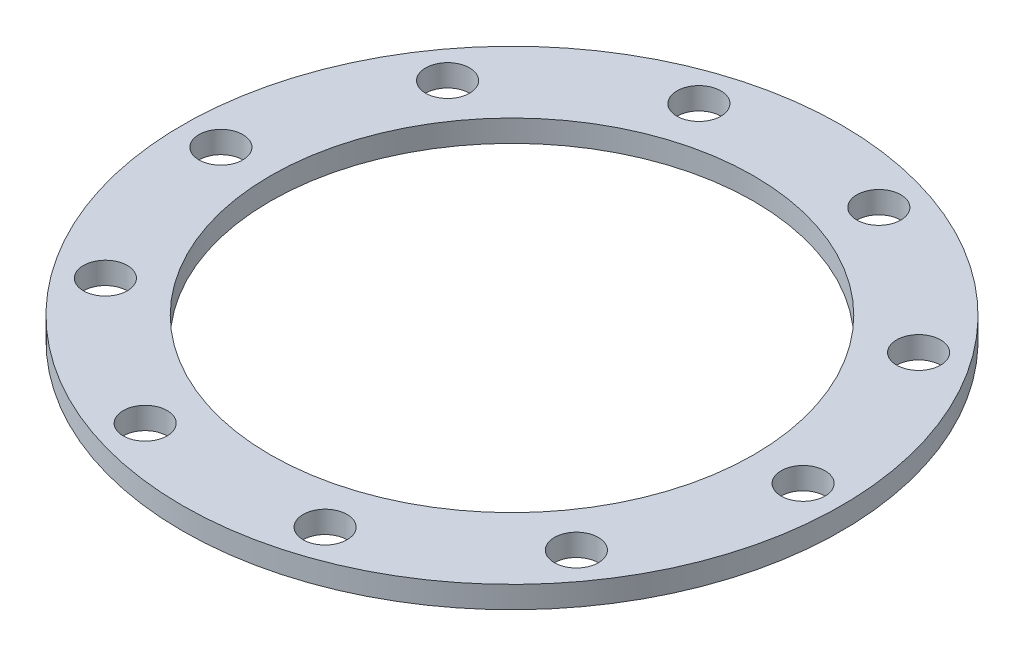
ISO-10303-21;
HEADER;
FILE_DESCRIPTION(('STEP AP214'),'2;1');
FILE_NAME('part.step','',(''),(''),'','','');
FILE_SCHEMA(('AUTOMOTIVE_DESIGN { 1 0 10303 214 1 1 1 1 }'));
ENDSEC;
DATA;
#1=APPLICATION_CONTEXT('core data for automotive mechanical design processes');
#2=APPLICATION_PROTOCOL_DEFINITION('international standard','automotive_design',2000,#1);
#3=PRODUCT_CONTEXT('',#1,'mechanical');
#4=PRODUCT('Part','Part','',(#3));
#5=PRODUCT_RELATED_PRODUCT_CATEGORY('part','',(#4));
#6=PRODUCT_DEFINITION_FORMATION('','',#4);
#7=PRODUCT_DEFINITION_CONTEXT('part definition',#1,'design');
#8=PRODUCT_DEFINITION('design','',#6,#7);
#9=PRODUCT_DEFINITION_SHAPE('','',#8);
#10=(LENGTH_UNIT() NAMED_UNIT(*) SI_UNIT(.MILLI.,.METRE.));
#11=(NAMED_UNIT(*) PLANE_ANGLE_UNIT() SI_UNIT($,.RADIAN.));
#12=(NAMED_UNIT(*) SI_UNIT($,.STERADIAN.) SOLID_ANGLE_UNIT());
#13=UNCERTAINTY_MEASURE_WITH_UNIT(LENGTH_MEASURE(1.E-05),#10,'distance_accuracy_value','');
#14=(GEOMETRIC_REPRESENTATION_CONTEXT(3) GLOBAL_UNCERTAINTY_ASSIGNED_CONTEXT((#13)) GLOBAL_UNIT_ASSIGNED_CONTEXT((#10,
#11,#12)) REPRESENTATION_CONTEXT('',''));
#15=CARTESIAN_POINT('',(0.,0.,0.));
#16=DIRECTION('',(0.,0.,1.));
#17=DIRECTION('',(1.,0.,0.));
#18=AXIS2_PLACEMENT_3D('',#15,#16,#17);
#19=CARTESIAN_POINT('',(0.,5.08,0.));
#20=DIRECTION('',(0.,1.,0.));
#21=DIRECTION('',(0.,0.,1.));
#22=AXIS2_PLACEMENT_3D('',#19,#20,#21);
#23=PLANE('',#22);
#24=CARTESIAN_POINT('',(-54.4549338913782,5.08,-39.5638253318056));
#25=DIRECTION('',(0.,1.,0.));
#26=DIRECTION('',(-0.587785252292462,0.,0.809016994374955));
#27=AXIS2_PLACEMENT_3D('',#24,#25,#26);
#28=CIRCLE('',#27,5.08);
#29=CARTESIAN_POINT('',(-57.4408829730239,5.08,-35.4540190003809));
#30=VERTEX_POINT('',#29);
#31=EDGE_CURVE('E62',#30,#30,#28,.T.);
#32=ORIENTED_EDGE('',*,*,#31,.F.);
#33=EDGE_LOOP('',(#32));
#34=FACE_BOUND('',#33,.T.);
#35=CARTESIAN_POINT('',(-20.7999338913784,5.08,-64.0156141118266));
#36=DIRECTION('',(0.,1.,0.));
#37=DIRECTION('',(-0.95105651629515,0.,0.309016994374958));
#38=AXIS2_PLACEMENT_3D('',#35,#36,#37);
#39=CIRCLE('',#38,5.08);
#40=CARTESIAN_POINT('',(-25.6313009941578,5.08,-62.4458077804018));
#41=VERTEX_POINT('',#40);
#42=EDGE_CURVE('E68',#41,#41,#39,.T.);
#43=ORIENTED_EDGE('',*,*,#42,.F.);
#44=EDGE_LOOP('',(#43));
#45=FACE_BOUND('',#44,.T.);
#46=CARTESIAN_POINT('',(20.7999338913771,5.08,-64.015614111827));
#47=DIRECTION('',(0.,1.,0.));
#48=DIRECTION('',(-0.951056516295157,0.,-0.309016994374938));
#49=AXIS2_PLACEMENT_3D('',#46,#47,#48);
#50=CIRCLE('',#49,5.08);
#51=CARTESIAN_POINT('',(15.9685667885977,5.08,-65.5854204432517));
#52=VERTEX_POINT('',#51);
#53=EDGE_CURVE('E74',#52,#52,#50,.T.);
#54=ORIENTED_EDGE('',*,*,#53,.F.);
#55=EDGE_LOOP('',(#54));
#56=FACE_BOUND('',#55,.T.);
#57=CARTESIAN_POINT('',(54.4549338913774,5.08,-39.5638253318068));
#58=DIRECTION('',(0.,1.,0.));
#59=DIRECTION('',(-0.58778525229248,0.,-0.809016994374942));
#60=AXIS2_PLACEMENT_3D('',#57,#58,#59);
#61=CIRCLE('',#60,5.08);
#62=CARTESIAN_POINT('',(51.4689848097315,5.08,-43.6736316632316));
#63=VERTEX_POINT('',#62);
#64=EDGE_CURVE('E80',#63,#63,#61,.T.);
#65=ORIENTED_EDGE('',*,*,#64,.F.);
#66=EDGE_LOOP('',(#65));
#67=FACE_BOUND('',#66,.T.);
#68=CARTESIAN_POINT('',(67.31,5.08,0.));
#69=DIRECTION('',(0.,1.,0.));
#70=DIRECTION('',(0.,0.,-1.));
#71=AXIS2_PLACEMENT_3D('',#68,#69,#70);
#72=CIRCLE('',#71,5.08);
#73=CARTESIAN_POINT('',(67.31,5.08,-5.08000000000001));
#74=VERTEX_POINT('',#73);
#75=EDGE_CURVE('E86',#74,#74,#72,.T.);
#76=ORIENTED_EDGE('',*,*,#75,.F.);
#77=EDGE_LOOP('',(#76));
#78=FACE_BOUND('',#77,.T.);
#79=CARTESIAN_POINT('',(54.4549338913779,5.08,39.5638253318061));
#80=DIRECTION('',(0.,1.,0.));
#81=DIRECTION('',(0.587785252292469,0.,-0.809016994374951));
#82=AXIS2_PLACEMENT_3D('',#79,#80,#81);
#83=CIRCLE('',#82,5.08);
#84=CARTESIAN_POINT('',(57.4408829730237,5.08,35.4540190003813));
#85=VERTEX_POINT('',#84);
#86=EDGE_CURVE('E92',#85,#85,#83,.T.);
#87=ORIENTED_EDGE('',*,*,#86,.F.);
#88=EDGE_LOOP('',(#87));
#89=FACE_BOUND('',#88,.T.);
#90=CARTESIAN_POINT('',(20.799933891378,5.08,64.0156141118267));
#91=DIRECTION('',(0.,1.,0.));
#92=DIRECTION('',(0.951056516295152,0.,-0.309016994374952));
#93=AXIS2_PLACEMENT_3D('',#90,#91,#92);
#94=CIRCLE('',#93,5.08);
#95=CARTESIAN_POINT('',(25.6313009941574,5.08,62.4458077804019));
#96=VERTEX_POINT('',#95);
#97=EDGE_CURVE('E98',#96,#96,#94,.T.);
#98=ORIENTED_EDGE('',*,*,#97,.F.);
#99=EDGE_LOOP('',(#98));
#100=FACE_BOUND('',#99,.T.);
#101=CARTESIAN_POINT('',(-20.7999338913775,5.08,64.0156141118268));
#102=DIRECTION('',(0.,1.,0.));
#103=DIRECTION('',(0.951056516295155,0.,0.309016994374945));
#104=AXIS2_PLACEMENT_3D('',#101,#102,#103);
#105=CIRCLE('',#104,5.08);
#106=CARTESIAN_POINT('',(-15.9685667885981,5.08,65.5854204432516));
#107=VERTEX_POINT('',#106);
#108=EDGE_CURVE('E104',#107,#107,#105,.T.);
#109=ORIENTED_EDGE('',*,*,#108,.F.);
#110=EDGE_LOOP('',(#109));
#111=FACE_BOUND('',#110,.T.);
#112=CARTESIAN_POINT('',(-54.4549338913777,5.08,39.5638253318065));
#113=DIRECTION('',(0.,1.,0.));
#114=DIRECTION('',(0.587785252292474,0.,0.809016994374947));
#115=AXIS2_PLACEMENT_3D('',#112,#113,#114);
#116=CIRCLE('',#115,5.08);
#117=CARTESIAN_POINT('',(-51.4689848097319,5.08,43.6736316632312));
#118=VERTEX_POINT('',#117);
#119=EDGE_CURVE('E56',#118,#118,#116,.T.);
#120=ORIENTED_EDGE('',*,*,#119,.F.);
#121=EDGE_LOOP('',(#120));
#122=FACE_BOUND('',#121,.T.);
#123=CARTESIAN_POINT('',(-67.31,5.08,0.));
#124=DIRECTION('',(0.,1.,0.));
#125=DIRECTION('',(0.,0.,1.));
#126=AXIS2_PLACEMENT_3D('',#123,#124,#125);
#127=CIRCLE('',#126,5.08);
#128=CARTESIAN_POINT('',(-67.31,5.08,5.08000000000001));
#129=VERTEX_POINT('',#128);
#130=EDGE_CURVE('E50',#129,#129,#127,.T.);
#131=ORIENTED_EDGE('',*,*,#130,.F.);
#132=EDGE_LOOP('',(#131));
#133=FACE_BOUND('',#132,.T.);
#134=CARTESIAN_POINT('',(0.,5.08,0.));
#135=DIRECTION('',(0.,1.,0.));
#136=DIRECTION('',(0.,0.,1.));
#137=AXIS2_PLACEMENT_3D('',#134,#135,#136);
#138=CIRCLE('',#137,76.2);
#139=CARTESIAN_POINT('',(0.,5.08,76.2));
#140=VERTEX_POINT('',#139);
#141=EDGE_CURVE('E10',#140,#140,#138,.T.);
#142=ORIENTED_EDGE('',*,*,#141,.T.);
#143=EDGE_LOOP('',(#142));
#144=FACE_BOUND('',#143,.T.);
#145=CARTESIAN_POINT('',(0.,5.08,0.));
#146=DIRECTION('',(0.,1.,0.));
#147=DIRECTION('',(0.,0.,1.));
#148=AXIS2_PLACEMENT_3D('',#145,#146,#147);
#149=CIRCLE('',#148,55.88);
#150=CARTESIAN_POINT('',(0.,5.08,55.88));
#151=VERTEX_POINT('',#150);
#152=EDGE_CURVE('E42',#151,#151,#149,.T.);
#153=ORIENTED_EDGE('',*,*,#152,.F.);
#154=EDGE_LOOP('',(#153));
#155=FACE_BOUND('',#154,.T.);
#156=ADVANCED_FACE('F31',(#34,#45,#56,#67,#78,#89,#100,#111,#122,#133,#144,#155),#23,.T.);
#157=CARTESIAN_POINT('',(0.,0.,0.));
#158=DIRECTION('',(0.,1.,0.));
#159=DIRECTION('',(0.,0.,1.));
#160=AXIS2_PLACEMENT_3D('',#157,#158,#159);
#161=PLANE('',#160);
#162=CARTESIAN_POINT('',(-54.4549338913782,0.,-39.5638253318056));
#163=DIRECTION('',(0.,1.,0.));
#164=DIRECTION('',(-0.587785252292462,0.,0.809016994374955));
#165=AXIS2_PLACEMENT_3D('',#162,#163,#164);
#166=CIRCLE('',#165,5.08);
#167=CARTESIAN_POINT('',(-57.4408829730239,0.,-35.4540190003809));
#168=VERTEX_POINT('',#167);
#169=EDGE_CURVE('E65',#168,#168,#166,.T.);
#170=ORIENTED_EDGE('',*,*,#169,.T.);
#171=EDGE_LOOP('',(#170));
#172=FACE_BOUND('',#171,.T.);
#173=CARTESIAN_POINT('',(-20.7999338913784,0.,-64.0156141118266));
#174=DIRECTION('',(0.,1.,0.));
#175=DIRECTION('',(-0.95105651629515,0.,0.309016994374958));
#176=AXIS2_PLACEMENT_3D('',#173,#174,#175);
#177=CIRCLE('',#176,5.08);
#178=CARTESIAN_POINT('',(-25.6313009941578,0.,-62.4458077804018));
#179=VERTEX_POINT('',#178);
#180=EDGE_CURVE('E71',#179,#179,#177,.T.);
#181=ORIENTED_EDGE('',*,*,#180,.T.);
#182=EDGE_LOOP('',(#181));
#183=FACE_BOUND('',#182,.T.);
#184=CARTESIAN_POINT('',(20.7999338913771,0.,-64.015614111827));
#185=DIRECTION('',(0.,1.,0.));
#186=DIRECTION('',(-0.951056516295157,0.,-0.309016994374938));
#187=AXIS2_PLACEMENT_3D('',#184,#185,#186);
#188=CIRCLE('',#187,5.08);
#189=CARTESIAN_POINT('',(15.9685667885977,0.,-65.5854204432517));
#190=VERTEX_POINT('',#189);
#191=EDGE_CURVE('E77',#190,#190,#188,.T.);
#192=ORIENTED_EDGE('',*,*,#191,.T.);
#193=EDGE_LOOP('',(#192));
#194=FACE_BOUND('',#193,.T.);
#195=CARTESIAN_POINT('',(54.4549338913774,0.,-39.5638253318068));
#196=DIRECTION('',(0.,1.,0.));
#197=DIRECTION('',(-0.58778525229248,0.,-0.809016994374942));
#198=AXIS2_PLACEMENT_3D('',#195,#196,#197);
#199=CIRCLE('',#198,5.08);
#200=CARTESIAN_POINT('',(51.4689848097315,0.,-43.6736316632316));
#201=VERTEX_POINT('',#200);
#202=EDGE_CURVE('E83',#201,#201,#199,.T.);
#203=ORIENTED_EDGE('',*,*,#202,.T.);
#204=EDGE_LOOP('',(#203));
#205=FACE_BOUND('',#204,.T.);
#206=CARTESIAN_POINT('',(67.31,0.,0.));
#207=DIRECTION('',(0.,1.,0.));
#208=DIRECTION('',(0.,0.,-1.));
#209=AXIS2_PLACEMENT_3D('',#206,#207,#208);
#210=CIRCLE('',#209,5.08);
#211=CARTESIAN_POINT('',(67.31,0.,-5.08000000000001));
#212=VERTEX_POINT('',#211);
#213=EDGE_CURVE('E89',#212,#212,#210,.T.);
#214=ORIENTED_EDGE('',*,*,#213,.T.);
#215=EDGE_LOOP('',(#214));
#216=FACE_BOUND('',#215,.T.);
#217=CARTESIAN_POINT('',(54.4549338913779,0.,39.5638253318061));
#218=DIRECTION('',(0.,1.,0.));
#219=DIRECTION('',(0.587785252292469,0.,-0.809016994374951));
#220=AXIS2_PLACEMENT_3D('',#217,#218,#219);
#221=CIRCLE('',#220,5.08);
#222=CARTESIAN_POINT('',(57.4408829730237,0.,35.4540190003813));
#223=VERTEX_POINT('',#222);
#224=EDGE_CURVE('E95',#223,#223,#221,.T.);
#225=ORIENTED_EDGE('',*,*,#224,.T.);
#226=EDGE_LOOP('',(#225));
#227=FACE_BOUND('',#226,.T.);
#228=CARTESIAN_POINT('',(20.799933891378,0.,64.0156141118267));
#229=DIRECTION('',(0.,1.,0.));
#230=DIRECTION('',(0.951056516295152,0.,-0.309016994374952));
#231=AXIS2_PLACEMENT_3D('',#228,#229,#230);
#232=CIRCLE('',#231,5.08);
#233=CARTESIAN_POINT('',(25.6313009941574,0.,62.4458077804019));
#234=VERTEX_POINT('',#233);
#235=EDGE_CURVE('E101',#234,#234,#232,.T.);
#236=ORIENTED_EDGE('',*,*,#235,.T.);
#237=EDGE_LOOP('',(#236));
#238=FACE_BOUND('',#237,.T.);
#239=CARTESIAN_POINT('',(-20.7999338913775,0.,64.0156141118268));
#240=DIRECTION('',(0.,1.,0.));
#241=DIRECTION('',(0.951056516295155,0.,0.309016994374945));
#242=AXIS2_PLACEMENT_3D('',#239,#240,#241);
#243=CIRCLE('',#242,5.08);
#244=CARTESIAN_POINT('',(-15.9685667885981,0.,65.5854204432516));
#245=VERTEX_POINT('',#244);
#246=EDGE_CURVE('E59',#245,#245,#243,.T.);
#247=ORIENTED_EDGE('',*,*,#246,.T.);
#248=EDGE_LOOP('',(#247));
#249=FACE_BOUND('',#248,.T.);
#250=CARTESIAN_POINT('',(-54.4549338913777,0.,39.5638253318065));
#251=DIRECTION('',(0.,1.,0.));
#252=DIRECTION('',(0.587785252292474,0.,0.809016994374947));
#253=AXIS2_PLACEMENT_3D('',#250,#251,#252);
#254=CIRCLE('',#253,5.08);
#255=CARTESIAN_POINT('',(-51.4689848097319,0.,43.6736316632312));
#256=VERTEX_POINT('',#255);
#257=EDGE_CURVE('E53',#256,#256,#254,.T.);
#258=ORIENTED_EDGE('',*,*,#257,.T.);
#259=EDGE_LOOP('',(#258));
#260=FACE_BOUND('',#259,.T.);
#261=CARTESIAN_POINT('',(-67.31,0.,0.));
#262=DIRECTION('',(0.,1.,0.));
#263=DIRECTION('',(0.,0.,1.));
#264=AXIS2_PLACEMENT_3D('',#261,#262,#263);
#265=CIRCLE('',#264,5.08);
#266=CARTESIAN_POINT('',(-67.31,0.,5.08000000000001));
#267=VERTEX_POINT('',#266);
#268=EDGE_CURVE('E47',#267,#267,#265,.T.);
#269=ORIENTED_EDGE('',*,*,#268,.T.);
#270=EDGE_LOOP('',(#269));
#271=FACE_BOUND('',#270,.T.);
#272=CARTESIAN_POINT('',(0.,0.,0.));
#273=DIRECTION('',(0.,1.,0.));
#274=DIRECTION('',(0.,0.,1.));
#275=AXIS2_PLACEMENT_3D('',#272,#273,#274);
#276=CIRCLE('',#275,76.2);
#277=CARTESIAN_POINT('',(0.,0.,76.2));
#278=VERTEX_POINT('',#277);
#279=EDGE_CURVE('E35',#278,#278,#276,.T.);
#280=ORIENTED_EDGE('',*,*,#279,.F.);
#281=EDGE_LOOP('',(#280));
#282=FACE_BOUND('',#281,.T.);
#283=CARTESIAN_POINT('',(0.,0.,0.));
#284=DIRECTION('',(0.,1.,0.));
#285=DIRECTION('',(0.,0.,1.));
#286=AXIS2_PLACEMENT_3D('',#283,#284,#285);
#287=CIRCLE('',#286,55.88);
#288=CARTESIAN_POINT('',(0.,0.,55.88));
#289=VERTEX_POINT('',#288);
#290=EDGE_CURVE('E44',#289,#289,#287,.T.);
#291=ORIENTED_EDGE('',*,*,#290,.T.);
#292=EDGE_LOOP('',(#291));
#293=FACE_BOUND('',#292,.T.);
#294=ADVANCED_FACE('F110',(#172,#183,#194,#205,#216,#227,#238,#249,#260,#271,#282,#293),#161,.F.);
#295=CARTESIAN_POINT('',(0.,5.08,0.));
#296=DIRECTION('',(0.,-1.,0.));
#297=DIRECTION('',(0.,0.,-1.));
#298=AXIS2_PLACEMENT_3D('',#295,#296,#297);
#299=CYLINDRICAL_SURFACE('',#298,76.2);
#300=ORIENTED_EDGE('',*,*,#141,.F.);
#301=EDGE_LOOP('',(#300));
#302=FACE_BOUND('',#301,.T.);
#303=ORIENTED_EDGE('',*,*,#279,.T.);
#304=EDGE_LOOP('',(#303));
#305=FACE_BOUND('',#304,.T.);
#306=ADVANCED_FACE('F33',(#302,#305),#299,.T.);
#307=CARTESIAN_POINT('',(0.,5.08,0.));
#308=DIRECTION('',(0.,-1.,0.));
#309=DIRECTION('',(0.,0.,-1.));
#310=AXIS2_PLACEMENT_3D('',#307,#308,#309);
#311=CYLINDRICAL_SURFACE('',#310,55.88);
#312=ORIENTED_EDGE('',*,*,#152,.T.);
#313=EDGE_LOOP('',(#312));
#314=FACE_BOUND('',#313,.T.);
#315=ORIENTED_EDGE('',*,*,#290,.F.);
#316=EDGE_LOOP('',(#315));
#317=FACE_BOUND('',#316,.T.);
#318=ADVANCED_FACE('F131',(#314,#317),#311,.F.);
#319=CARTESIAN_POINT('',(-67.31,0.,0.));
#320=DIRECTION('',(0.,1.,0.));
#321=DIRECTION('',(0.,0.,1.));
#322=AXIS2_PLACEMENT_3D('',#319,#320,#321);
#323=CYLINDRICAL_SURFACE('',#322,5.08);
#324=ORIENTED_EDGE('',*,*,#268,.F.);
#325=EDGE_LOOP('',(#324));
#326=FACE_BOUND('',#325,.T.);
#327=ORIENTED_EDGE('',*,*,#130,.T.);
#328=EDGE_LOOP('',(#327));
#329=FACE_BOUND('',#328,.T.);
#330=ADVANCED_FACE('F134',(#326,#329),#323,.F.);
#331=CARTESIAN_POINT('',(-54.4549338913777,0.,39.5638253318065));
#332=DIRECTION('',(0.,1.,0.));
#333=DIRECTION('',(0.,0.,1.));
#334=AXIS2_PLACEMENT_3D('',#331,#332,#333);
#335=CYLINDRICAL_SURFACE('',#334,5.08);
#336=ORIENTED_EDGE('',*,*,#257,.F.);
#337=EDGE_LOOP('',(#336));
#338=FACE_BOUND('',#337,.T.);
#339=ORIENTED_EDGE('',*,*,#119,.T.);
#340=EDGE_LOOP('',(#339));
#341=FACE_BOUND('',#340,.T.);
#342=ADVANCED_FACE('F117',(#338,#341),#335,.F.);
#343=CARTESIAN_POINT('',(-20.7999338913775,0.,64.0156141118268));
#344=DIRECTION('',(0.,1.,0.));
#345=DIRECTION('',(0.,0.,1.));
#346=AXIS2_PLACEMENT_3D('',#343,#344,#345);
#347=CYLINDRICAL_SURFACE('',#346,5.08);
#348=ORIENTED_EDGE('',*,*,#246,.F.);
#349=EDGE_LOOP('',(#348));
#350=FACE_BOUND('',#349,.T.);
#351=ORIENTED_EDGE('',*,*,#108,.T.);
#352=EDGE_LOOP('',(#351));
#353=FACE_BOUND('',#352,.T.);
#354=ADVANCED_FACE('F113',(#350,#353),#347,.F.);
#355=CARTESIAN_POINT('',(20.799933891378,0.,64.0156141118267));
#356=DIRECTION('',(0.,1.,0.));
#357=DIRECTION('',(0.,0.,1.));
#358=AXIS2_PLACEMENT_3D('',#355,#356,#357);
#359=CYLINDRICAL_SURFACE('',#358,5.08);
#360=ORIENTED_EDGE('',*,*,#235,.F.);
#361=EDGE_LOOP('',(#360));
#362=FACE_BOUND('',#361,.T.);
#363=ORIENTED_EDGE('',*,*,#97,.T.);
#364=EDGE_LOOP('',(#363));
#365=FACE_BOUND('',#364,.T.);
#366=ADVANCED_FACE('F116',(#362,#365),#359,.F.);
#367=CARTESIAN_POINT('',(54.4549338913779,0.,39.5638253318061));
#368=DIRECTION('',(0.,1.,0.));
#369=DIRECTION('',(0.,0.,1.));
#370=AXIS2_PLACEMENT_3D('',#367,#368,#369);
#371=CYLINDRICAL_SURFACE('',#370,5.08);
#372=ORIENTED_EDGE('',*,*,#224,.F.);
#373=EDGE_LOOP('',(#372));
#374=FACE_BOUND('',#373,.T.);
#375=ORIENTED_EDGE('',*,*,#86,.T.);
#376=EDGE_LOOP('',(#375));
#377=FACE_BOUND('',#376,.T.);
#378=ADVANCED_FACE('F171',(#374,#377),#371,.F.);
#379=CARTESIAN_POINT('',(67.31,0.,0.));
#380=DIRECTION('',(0.,1.,0.));
#381=DIRECTION('',(0.,0.,1.));
#382=AXIS2_PLACEMENT_3D('',#379,#380,#381);
#383=CYLINDRICAL_SURFACE('',#382,5.08);
#384=ORIENTED_EDGE('',*,*,#213,.F.);
#385=EDGE_LOOP('',(#384));
#386=FACE_BOUND('',#385,.T.);
#387=ORIENTED_EDGE('',*,*,#75,.T.);
#388=EDGE_LOOP('',(#387));
#389=FACE_BOUND('',#388,.T.);
#390=ADVANCED_FACE('F167',(#386,#389),#383,.F.);
#391=CARTESIAN_POINT('',(54.4549338913774,0.,-39.5638253318068));
#392=DIRECTION('',(0.,1.,0.));
#393=DIRECTION('',(0.,0.,1.));
#394=AXIS2_PLACEMENT_3D('',#391,#392,#393);
#395=CYLINDRICAL_SURFACE('',#394,5.08);
#396=ORIENTED_EDGE('',*,*,#202,.F.);
#397=EDGE_LOOP('',(#396));
#398=FACE_BOUND('',#397,.T.);
#399=ORIENTED_EDGE('',*,*,#64,.T.);
#400=EDGE_LOOP('',(#399));
#401=FACE_BOUND('',#400,.T.);
#402=ADVANCED_FACE('F163',(#398,#401),#395,.F.);
#403=CARTESIAN_POINT('',(20.7999338913771,0.,-64.015614111827));
#404=DIRECTION('',(0.,1.,0.));
#405=DIRECTION('',(0.,0.,1.));
#406=AXIS2_PLACEMENT_3D('',#403,#404,#405);
#407=CYLINDRICAL_SURFACE('',#406,5.08);
#408=ORIENTED_EDGE('',*,*,#191,.F.);
#409=EDGE_LOOP('',(#408));
#410=FACE_BOUND('',#409,.T.);
#411=ORIENTED_EDGE('',*,*,#53,.T.);
#412=EDGE_LOOP('',(#411));
#413=FACE_BOUND('',#412,.T.);
#414=ADVANCED_FACE('F159',(#410,#413),#407,.F.);
#415=CARTESIAN_POINT('',(-20.7999338913784,0.,-64.0156141118266));
#416=DIRECTION('',(0.,1.,0.));
#417=DIRECTION('',(0.,0.,1.));
#418=AXIS2_PLACEMENT_3D('',#415,#416,#417);
#419=CYLINDRICAL_SURFACE('',#418,5.08);
#420=ORIENTED_EDGE('',*,*,#180,.F.);
#421=EDGE_LOOP('',(#420));
#422=FACE_BOUND('',#421,.T.);
#423=ORIENTED_EDGE('',*,*,#42,.T.);
#424=EDGE_LOOP('',(#423));
#425=FACE_BOUND('',#424,.T.);
#426=ADVANCED_FACE('F155',(#422,#425),#419,.F.);
#427=CARTESIAN_POINT('',(-54.4549338913782,0.,-39.5638253318056));
#428=DIRECTION('',(0.,1.,0.));
#429=DIRECTION('',(0.,0.,1.));
#430=AXIS2_PLACEMENT_3D('',#427,#428,#429);
#431=CYLINDRICAL_SURFACE('',#430,5.08);
#432=ORIENTED_EDGE('',*,*,#169,.F.);
#433=EDGE_LOOP('',(#432));
#434=FACE_BOUND('',#433,.T.);
#435=ORIENTED_EDGE('',*,*,#31,.T.);
#436=EDGE_LOOP('',(#435));
#437=FACE_BOUND('',#436,.T.);
#438=ADVANCED_FACE('F152',(#434,#437),#431,.F.);
#439=CLOSED_SHELL('',(#156,#294,#306,#318,#330,#342,#354,#366,#378,#390,#402,#414,#426,#438));
#440=MANIFOLD_SOLID_BREP('B2',#439);
#441=ADVANCED_BREP_SHAPE_REPRESENTATION('',(#18,#440),#14);
#442=SHAPE_DEFINITION_REPRESENTATION(#9,#441);
ENDSEC;
END-ISO-10303-21;
